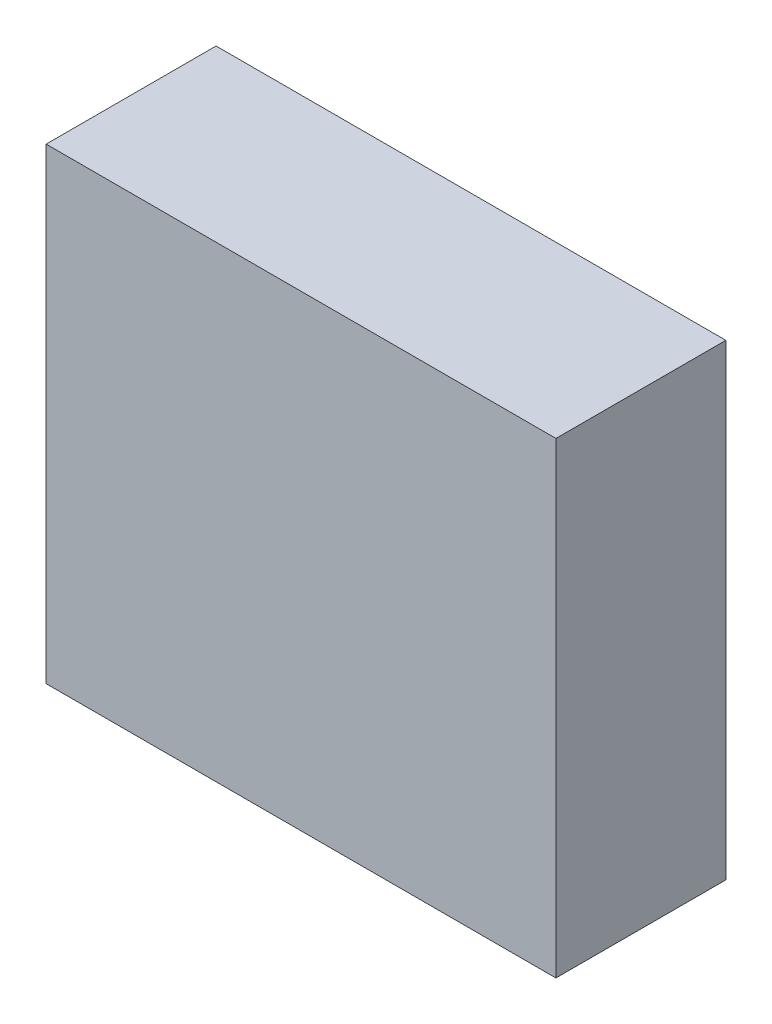
ISO-10303-21;
HEADER;
FILE_DESCRIPTION(('STEP AP214'),'2;1');
FILE_NAME('part.step','',(''),(''),'','','');
FILE_SCHEMA(('AUTOMOTIVE_DESIGN { 1 0 10303 214 1 1 1 1 }'));
ENDSEC;
DATA;
#1=APPLICATION_CONTEXT('core data for automotive mechanical design processes');
#2=APPLICATION_PROTOCOL_DEFINITION('international standard','automotive_design',2000,#1);
#3=PRODUCT_CONTEXT('',#1,'mechanical');
#4=PRODUCT('Part','Part','',(#3));
#5=PRODUCT_RELATED_PRODUCT_CATEGORY('part','',(#4));
#6=PRODUCT_DEFINITION_FORMATION('','',#4);
#7=PRODUCT_DEFINITION_CONTEXT('part definition',#1,'design');
#8=PRODUCT_DEFINITION('design','',#6,#7);
#9=PRODUCT_DEFINITION_SHAPE('','',#8);
#10=(LENGTH_UNIT() NAMED_UNIT(*) SI_UNIT(.MILLI.,.METRE.));
#11=(NAMED_UNIT(*) PLANE_ANGLE_UNIT() SI_UNIT($,.RADIAN.));
#12=(NAMED_UNIT(*) SI_UNIT($,.STERADIAN.) SOLID_ANGLE_UNIT());
#13=UNCERTAINTY_MEASURE_WITH_UNIT(LENGTH_MEASURE(1.E-05),#10,'distance_accuracy_value','');
#14=(GEOMETRIC_REPRESENTATION_CONTEXT(3) GLOBAL_UNCERTAINTY_ASSIGNED_CONTEXT((#13)) GLOBAL_UNIT_ASSIGNED_CONTEXT((#10,
#11,#12)) REPRESENTATION_CONTEXT('',''));
#15=CARTESIAN_POINT('',(0.,0.,0.));
#16=DIRECTION('',(0.,0.,1.));
#17=DIRECTION('',(1.,0.,0.));
#18=AXIS2_PLACEMENT_3D('',#15,#16,#17);
#19=CARTESIAN_POINT('',(-76.2,69.85,50.8));
#20=DIRECTION('',(1.,0.,0.));
#21=DIRECTION('',(0.,1.,0.));
#22=AXIS2_PLACEMENT_3D('',#19,#20,#21);
#23=PLANE('',#22);
#24=DIRECTION('',(0.,-1.,0.));
#25=VECTOR('',#24,1.);
#26=CARTESIAN_POINT('',(-76.2,69.85,0.));
#27=LINE('',#26,#25);
#28=CARTESIAN_POINT('',(-76.2,69.85,0.));
#29=VERTEX_POINT('',#28);
#30=CARTESIAN_POINT('',(-76.2,-69.85,0.));
#31=VERTEX_POINT('',#30);
#32=EDGE_CURVE('E97',#29,#31,#27,.T.);
#33=ORIENTED_EDGE('',*,*,#32,.T.);
#34=DIRECTION('',(0.,0.,-1.));
#35=VECTOR('',#34,1.);
#36=CARTESIAN_POINT('',(-76.2,-69.85,50.8));
#37=LINE('',#36,#35);
#38=CARTESIAN_POINT('',(-76.2,-69.85,50.8));
#39=VERTEX_POINT('',#38);
#40=EDGE_CURVE('E11',#39,#31,#37,.T.);
#41=ORIENTED_EDGE('',*,*,#40,.F.);
#42=DIRECTION('',(0.,-1.,0.));
#43=VECTOR('',#42,1.);
#44=CARTESIAN_POINT('',(-76.2,69.85,50.8));
#45=LINE('',#44,#43);
#46=CARTESIAN_POINT('',(-76.2,69.85,50.8));
#47=VERTEX_POINT('',#46);
#48=EDGE_CURVE('E85',#47,#39,#45,.T.);
#49=ORIENTED_EDGE('',*,*,#48,.F.);
#50=DIRECTION('',(0.,0.,-1.));
#51=VECTOR('',#50,1.);
#52=CARTESIAN_POINT('',(-76.2,69.85,50.8));
#53=LINE('',#52,#51);
#54=EDGE_CURVE('E93',#47,#29,#53,.T.);
#55=ORIENTED_EDGE('',*,*,#54,.T.);
#56=EDGE_LOOP('',(#33,#41,#49,#55));
#57=FACE_BOUND('',#56,.T.);
#58=ADVANCED_FACE('F34',(#57),#23,.F.);
#59=CARTESIAN_POINT('',(-76.2,-69.85,50.8));
#60=DIRECTION('',(0.,1.,0.));
#61=DIRECTION('',(0.,0.,1.));
#62=AXIS2_PLACEMENT_3D('',#59,#60,#61);
#63=PLANE('',#62);
#64=DIRECTION('',(1.,0.,0.));
#65=VECTOR('',#64,1.);
#66=CARTESIAN_POINT('',(-76.2,-69.85,0.));
#67=LINE('',#66,#65);
#68=CARTESIAN_POINT('',(76.2,-69.85,0.));
#69=VERTEX_POINT('',#68);
#70=EDGE_CURVE('E89',#31,#69,#67,.T.);
#71=ORIENTED_EDGE('',*,*,#70,.T.);
#72=DIRECTION('',(0.,0.,-1.));
#73=VECTOR('',#72,1.);
#74=CARTESIAN_POINT('',(76.2,-69.85,50.8));
#75=LINE('',#74,#73);
#76=CARTESIAN_POINT('',(76.2,-69.85,50.8));
#77=VERTEX_POINT('',#76);
#78=EDGE_CURVE('E42',#77,#69,#75,.T.);
#79=ORIENTED_EDGE('',*,*,#78,.F.);
#80=DIRECTION('',(1.,0.,0.));
#81=VECTOR('',#80,1.);
#82=CARTESIAN_POINT('',(-76.2,-69.85,50.8));
#83=LINE('',#82,#81);
#84=EDGE_CURVE('E80',#39,#77,#83,.T.);
#85=ORIENTED_EDGE('',*,*,#84,.F.);
#86=ORIENTED_EDGE('',*,*,#40,.T.);
#87=EDGE_LOOP('',(#71,#79,#85,#86));
#88=FACE_BOUND('',#87,.T.);
#89=ADVANCED_FACE('F88',(#88),#63,.F.);
#90=CARTESIAN_POINT('',(76.2,69.85,50.8));
#91=DIRECTION('',(-1.,0.,0.));
#92=DIRECTION('',(0.,-1.,0.));
#93=AXIS2_PLACEMENT_3D('',#90,#91,#92);
#94=PLANE('',#93);
#95=DIRECTION('',(0.,1.,0.));
#96=VECTOR('',#95,1.);
#97=CARTESIAN_POINT('',(76.2,69.85,0.));
#98=LINE('',#97,#96);
#99=CARTESIAN_POINT('',(76.2,69.85,0.));
#100=VERTEX_POINT('',#99);
#101=EDGE_CURVE('E67',#69,#100,#98,.T.);
#102=ORIENTED_EDGE('',*,*,#101,.T.);
#103=DIRECTION('',(0.,0.,-1.));
#104=VECTOR('',#103,1.);
#105=CARTESIAN_POINT('',(76.2,69.85,50.8));
#106=LINE('',#105,#104);
#107=CARTESIAN_POINT('',(76.2,69.85,50.8));
#108=VERTEX_POINT('',#107);
#109=EDGE_CURVE('E90',#108,#100,#106,.T.);
#110=ORIENTED_EDGE('',*,*,#109,.F.);
#111=DIRECTION('',(0.,1.,0.));
#112=VECTOR('',#111,1.);
#113=CARTESIAN_POINT('',(76.2,69.85,50.8));
#114=LINE('',#113,#112);
#115=EDGE_CURVE('E83',#77,#108,#114,.T.);
#116=ORIENTED_EDGE('',*,*,#115,.F.);
#117=ORIENTED_EDGE('',*,*,#78,.T.);
#118=EDGE_LOOP('',(#102,#110,#116,#117));
#119=FACE_BOUND('',#118,.T.);
#120=ADVANCED_FACE('F91',(#119),#94,.F.);
#121=CARTESIAN_POINT('',(-76.2,69.85,50.8));
#122=DIRECTION('',(0.,-1.,0.));
#123=DIRECTION('',(0.,0.,-1.));
#124=AXIS2_PLACEMENT_3D('',#121,#122,#123);
#125=PLANE('',#124);
#126=DIRECTION('',(-1.,0.,0.));
#127=VECTOR('',#126,1.);
#128=CARTESIAN_POINT('',(-76.2,69.85,0.));
#129=LINE('',#128,#127);
#130=EDGE_CURVE('E73',#100,#29,#129,.T.);
#131=ORIENTED_EDGE('',*,*,#130,.T.);
#132=ORIENTED_EDGE('',*,*,#54,.F.);
#133=DIRECTION('',(-1.,0.,0.));
#134=VECTOR('',#133,1.);
#135=CARTESIAN_POINT('',(-76.2,69.85,50.8));
#136=LINE('',#135,#134);
#137=EDGE_CURVE('E50',#108,#47,#136,.T.);
#138=ORIENTED_EDGE('',*,*,#137,.F.);
#139=ORIENTED_EDGE('',*,*,#109,.T.);
#140=EDGE_LOOP('',(#131,#132,#138,#139));
#141=FACE_BOUND('',#140,.T.);
#142=ADVANCED_FACE('F104',(#141),#125,.F.);
#143=CARTESIAN_POINT('',(0.,0.,50.8));
#144=DIRECTION('',(0.,0.,1.));
#145=DIRECTION('',(1.,0.,0.));
#146=AXIS2_PLACEMENT_3D('',#143,#144,#145);
#147=PLANE('',#146);
#148=ORIENTED_EDGE('',*,*,#48,.T.);
#149=ORIENTED_EDGE('',*,*,#84,.T.);
#150=ORIENTED_EDGE('',*,*,#115,.T.);
#151=ORIENTED_EDGE('',*,*,#137,.T.);
#152=EDGE_LOOP('',(#148,#149,#150,#151));
#153=FACE_BOUND('',#152,.T.);
#154=ADVANCED_FACE('F81',(#153),#147,.T.);
#155=CARTESIAN_POINT('',(0.,0.,0.));
#156=DIRECTION('',(0.,0.,1.));
#157=DIRECTION('',(1.,0.,0.));
#158=AXIS2_PLACEMENT_3D('',#155,#156,#157);
#159=PLANE('',#158);
#160=ORIENTED_EDGE('',*,*,#32,.F.);
#161=ORIENTED_EDGE('',*,*,#130,.F.);
#162=ORIENTED_EDGE('',*,*,#101,.F.);
#163=ORIENTED_EDGE('',*,*,#70,.F.);
#164=EDGE_LOOP('',(#160,#161,#162,#163));
#165=FACE_BOUND('',#164,.T.);
#166=ADVANCED_FACE('F107',(#165),#159,.F.);
#167=CLOSED_SHELL('',(#58,#89,#120,#142,#154,#166));
#168=MANIFOLD_SOLID_BREP('B2',#167);
#169=ADVANCED_BREP_SHAPE_REPRESENTATION('',(#18,#168),#14);
#170=SHAPE_DEFINITION_REPRESENTATION(#9,#169);
ENDSEC;
END-ISO-10303-21;
